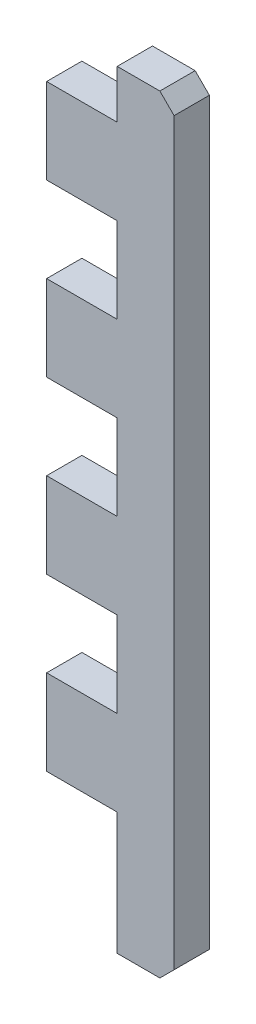
ISO-10303-21;
HEADER;
FILE_DESCRIPTION(('STEP AP214'),'2;1');
FILE_NAME('part.step','',(''),(''),'','','');
FILE_SCHEMA(('AUTOMOTIVE_DESIGN { 1 0 10303 214 1 1 1 1 }'));
ENDSEC;
DATA;
#1=APPLICATION_CONTEXT('core data for automotive mechanical design processes');
#2=APPLICATION_PROTOCOL_DEFINITION('international standard','automotive_design',2000,#1);
#3=PRODUCT_CONTEXT('',#1,'mechanical');
#4=PRODUCT('Part','Part','',(#3));
#5=PRODUCT_RELATED_PRODUCT_CATEGORY('part','',(#4));
#6=PRODUCT_DEFINITION_FORMATION('','',#4);
#7=PRODUCT_DEFINITION_CONTEXT('part definition',#1,'design');
#8=PRODUCT_DEFINITION('design','',#6,#7);
#9=PRODUCT_DEFINITION_SHAPE('','',#8);
#10=(LENGTH_UNIT() NAMED_UNIT(*) SI_UNIT(.MILLI.,.METRE.));
#11=(NAMED_UNIT(*) PLANE_ANGLE_UNIT() SI_UNIT($,.RADIAN.));
#12=(NAMED_UNIT(*) SI_UNIT($,.STERADIAN.) SOLID_ANGLE_UNIT());
#13=UNCERTAINTY_MEASURE_WITH_UNIT(LENGTH_MEASURE(1.E-05),#10,'distance_accuracy_value','');
#14=(GEOMETRIC_REPRESENTATION_CONTEXT(3) GLOBAL_UNCERTAINTY_ASSIGNED_CONTEXT((#13)) GLOBAL_UNIT_ASSIGNED_CONTEXT((#10,
#11,#12)) REPRESENTATION_CONTEXT('',''));
#15=CARTESIAN_POINT('',(0.,0.,0.));
#16=DIRECTION('',(0.,0.,1.));
#17=DIRECTION('',(1.,0.,0.));
#18=AXIS2_PLACEMENT_3D('',#15,#16,#17);
#19=CARTESIAN_POINT('',(0.,73.,12.4));
#20=DIRECTION('',(1.,0.,0.));
#21=DIRECTION('',(0.,0.,-1.));
#22=AXIS2_PLACEMENT_3D('',#19,#20,#21);
#23=PLANE('',#22);
#24=DIRECTION('',(0.,-1.,0.));
#25=VECTOR('',#24,1.);
#26=CARTESIAN_POINT('',(0.,73.,0.));
#27=LINE('',#26,#25);
#28=CARTESIAN_POINT('',(0.,103.,0.));
#29=VERTEX_POINT('',#28);
#30=CARTESIAN_POINT('',(0.,73.,0.));
#31=VERTEX_POINT('',#30);
#32=EDGE_CURVE('E213',#29,#31,#27,.T.);
#33=ORIENTED_EDGE('',*,*,#32,.T.);
#34=DIRECTION('',(0.,0.,-1.));
#35=VECTOR('',#34,1.);
#36=CARTESIAN_POINT('',(0.,73.,12.4));
#37=LINE('',#36,#35);
#38=CARTESIAN_POINT('',(0.,73.,12.4));
#39=VERTEX_POINT('',#38);
#40=EDGE_CURVE('E11',#39,#31,#37,.T.);
#41=ORIENTED_EDGE('',*,*,#40,.F.);
#42=DIRECTION('',(0.,-1.,0.));
#43=VECTOR('',#42,1.);
#44=CARTESIAN_POINT('',(0.,73.,12.4));
#45=LINE('',#44,#43);
#46=CARTESIAN_POINT('',(0.,103.,12.4));
#47=VERTEX_POINT('',#46);
#48=EDGE_CURVE('E255',#47,#39,#45,.T.);
#49=ORIENTED_EDGE('',*,*,#48,.F.);
#50=DIRECTION('',(0.,0.,-1.));
#51=VECTOR('',#50,1.);
#52=CARTESIAN_POINT('',(0.,103.,12.4));
#53=LINE('',#52,#51);
#54=EDGE_CURVE('E209',#47,#29,#53,.T.);
#55=ORIENTED_EDGE('',*,*,#54,.T.);
#56=EDGE_LOOP('',(#33,#41,#49,#55));
#57=FACE_BOUND('',#56,.T.);
#58=ADVANCED_FACE('F33',(#57),#23,.F.);
#59=CARTESIAN_POINT('',(0.,73.,12.4));
#60=DIRECTION('',(0.,-1.,0.));
#61=DIRECTION('',(0.,0.,-1.));
#62=AXIS2_PLACEMENT_3D('',#59,#60,#61);
#63=PLANE('',#62);
#64=DIRECTION('',(-1.,0.,0.));
#65=VECTOR('',#64,1.);
#66=CARTESIAN_POINT('',(0.,73.,0.));
#67=LINE('',#66,#65);
#68=CARTESIAN_POINT('',(-24.8,73.,0.));
#69=VERTEX_POINT('',#68);
#70=EDGE_CURVE('E216',#31,#69,#67,.T.);
#71=ORIENTED_EDGE('',*,*,#70,.T.);
#72=DIRECTION('',(0.,0.,-1.));
#73=VECTOR('',#72,1.);
#74=CARTESIAN_POINT('',(-24.8,73.,12.4));
#75=LINE('',#74,#73);
#76=CARTESIAN_POINT('',(-24.8,73.,12.4));
#77=VERTEX_POINT('',#76);
#78=EDGE_CURVE('E41',#77,#69,#75,.T.);
#79=ORIENTED_EDGE('',*,*,#78,.F.);
#80=DIRECTION('',(-1.,0.,0.));
#81=VECTOR('',#80,1.);
#82=CARTESIAN_POINT('',(0.,73.,12.4));
#83=LINE('',#82,#81);
#84=EDGE_CURVE('E134',#39,#77,#83,.T.);
#85=ORIENTED_EDGE('',*,*,#84,.F.);
#86=ORIENTED_EDGE('',*,*,#40,.T.);
#87=EDGE_LOOP('',(#71,#79,#85,#86));
#88=FACE_BOUND('',#87,.T.);
#89=ADVANCED_FACE('F383',(#88),#63,.F.);
#90=CARTESIAN_POINT('',(-24.8,73.,12.4));
#91=DIRECTION('',(1.,0.,0.));
#92=DIRECTION('',(0.,0.,-1.));
#93=AXIS2_PLACEMENT_3D('',#90,#91,#92);
#94=PLANE('',#93);
#95=DIRECTION('',(0.,-1.,0.));
#96=VECTOR('',#95,1.);
#97=CARTESIAN_POINT('',(-24.8,73.,0.));
#98=LINE('',#97,#96);
#99=CARTESIAN_POINT('',(-24.8,43.,0.));
#100=VERTEX_POINT('',#99);
#101=EDGE_CURVE('E218',#69,#100,#98,.T.);
#102=ORIENTED_EDGE('',*,*,#101,.T.);
#103=DIRECTION('',(0.,0.,-1.));
#104=VECTOR('',#103,1.);
#105=CARTESIAN_POINT('',(-24.8,43.,12.4));
#106=LINE('',#105,#104);
#107=CARTESIAN_POINT('',(-24.8,43.,12.4));
#108=VERTEX_POINT('',#107);
#109=EDGE_CURVE('E304',#108,#100,#106,.T.);
#110=ORIENTED_EDGE('',*,*,#109,.F.);
#111=DIRECTION('',(0.,-1.,0.));
#112=VECTOR('',#111,1.);
#113=CARTESIAN_POINT('',(-24.8,73.,12.4));
#114=LINE('',#113,#112);
#115=EDGE_CURVE('E312',#77,#108,#114,.T.);
#116=ORIENTED_EDGE('',*,*,#115,.F.);
#117=ORIENTED_EDGE('',*,*,#78,.T.);
#118=EDGE_LOOP('',(#102,#110,#116,#117));
#119=FACE_BOUND('',#118,.T.);
#120=ADVANCED_FACE('F310',(#119),#94,.F.);
#121=CARTESIAN_POINT('',(0.,43.,12.4));
#122=DIRECTION('',(0.,1.,0.));
#123=DIRECTION('',(0.,0.,1.));
#124=AXIS2_PLACEMENT_3D('',#121,#122,#123);
#125=PLANE('',#124);
#126=DIRECTION('',(1.,0.,0.));
#127=VECTOR('',#126,1.);
#128=CARTESIAN_POINT('',(0.,43.,0.));
#129=LINE('',#128,#127);
#130=CARTESIAN_POINT('',(0.,43.,0.));
#131=VERTEX_POINT('',#130);
#132=EDGE_CURVE('E220',#100,#131,#129,.T.);
#133=ORIENTED_EDGE('',*,*,#132,.T.);
#134=DIRECTION('',(0.,0.,-1.));
#135=VECTOR('',#134,1.);
#136=CARTESIAN_POINT('',(0.,43.,12.4));
#137=LINE('',#136,#135);
#138=CARTESIAN_POINT('',(0.,43.,12.4));
#139=VERTEX_POINT('',#138);
#140=EDGE_CURVE('E301',#139,#131,#137,.T.);
#141=ORIENTED_EDGE('',*,*,#140,.F.);
#142=DIRECTION('',(1.,0.,0.));
#143=VECTOR('',#142,1.);
#144=CARTESIAN_POINT('',(0.,43.,12.4));
#145=LINE('',#144,#143);
#146=EDGE_CURVE('E330',#108,#139,#145,.T.);
#147=ORIENTED_EDGE('',*,*,#146,.F.);
#148=ORIENTED_EDGE('',*,*,#109,.T.);
#149=EDGE_LOOP('',(#133,#141,#147,#148));
#150=FACE_BOUND('',#149,.T.);
#151=ADVANCED_FACE('F321',(#150),#125,.F.);
#152=CARTESIAN_POINT('',(0.,0.,12.4));
#153=DIRECTION('',(1.,0.,0.));
#154=DIRECTION('',(0.,0.,-1.));
#155=AXIS2_PLACEMENT_3D('',#152,#153,#154);
#156=PLANE('',#155);
#157=DIRECTION('',(0.,-1.,0.));
#158=VECTOR('',#157,1.);
#159=CARTESIAN_POINT('',(0.,0.,0.));
#160=LINE('',#159,#158);
#161=CARTESIAN_POINT('',(0.,0.,0.));
#162=VERTEX_POINT('',#161);
#163=EDGE_CURVE('E222',#131,#162,#160,.T.);
#164=ORIENTED_EDGE('',*,*,#163,.T.);
#165=DIRECTION('',(0.,0.,-1.));
#166=VECTOR('',#165,1.);
#167=CARTESIAN_POINT('',(0.,0.,12.4));
#168=LINE('',#167,#166);
#169=CARTESIAN_POINT('',(0.,0.,12.4));
#170=VERTEX_POINT('',#169);
#171=EDGE_CURVE('E298',#170,#162,#168,.T.);
#172=ORIENTED_EDGE('',*,*,#171,.F.);
#173=DIRECTION('',(0.,-1.,0.));
#174=VECTOR('',#173,1.);
#175=CARTESIAN_POINT('',(0.,0.,12.4));
#176=LINE('',#175,#174);
#177=EDGE_CURVE('E327',#139,#170,#176,.T.);
#178=ORIENTED_EDGE('',*,*,#177,.F.);
#179=ORIENTED_EDGE('',*,*,#140,.T.);
#180=EDGE_LOOP('',(#164,#172,#178,#179));
#181=FACE_BOUND('',#180,.T.);
#182=ADVANCED_FACE('F325',(#181),#156,.F.);
#183=CARTESIAN_POINT('',(0.,0.,12.4));
#184=DIRECTION('',(0.,1.,0.));
#185=DIRECTION('',(0.,0.,1.));
#186=AXIS2_PLACEMENT_3D('',#183,#184,#185);
#187=PLANE('',#186);
#188=DIRECTION('',(1.,0.,0.));
#189=VECTOR('',#188,1.);
#190=CARTESIAN_POINT('',(0.,0.,0.));
#191=LINE('',#190,#189);
#192=CARTESIAN_POINT('',(15.,0.,0.));
#193=VERTEX_POINT('',#192);
#194=EDGE_CURVE('E224',#162,#193,#191,.T.);
#195=ORIENTED_EDGE('',*,*,#194,.T.);
#196=DIRECTION('',(0.,0.,-1.));
#197=VECTOR('',#196,1.);
#198=CARTESIAN_POINT('',(15.,0.,12.4));
#199=LINE('',#198,#197);
#200=CARTESIAN_POINT('',(15.,0.,12.4));
#201=VERTEX_POINT('',#200);
#202=EDGE_CURVE('E295',#201,#193,#199,.T.);
#203=ORIENTED_EDGE('',*,*,#202,.F.);
#204=DIRECTION('',(1.,0.,0.));
#205=VECTOR('',#204,1.);
#206=CARTESIAN_POINT('',(0.,0.,12.4));
#207=LINE('',#206,#205);
#208=EDGE_CURVE('E329',#170,#201,#207,.T.);
#209=ORIENTED_EDGE('',*,*,#208,.F.);
#210=ORIENTED_EDGE('',*,*,#171,.T.);
#211=EDGE_LOOP('',(#195,#203,#209,#210));
#212=FACE_BOUND('',#211,.T.);
#213=ADVANCED_FACE('F396',(#212),#187,.F.);
#214=CARTESIAN_POINT('',(20.,5.,12.4));
#215=DIRECTION('',(-0.707106781186547,0.707106781186548,0.));
#216=DIRECTION('',(-0.707106781186548,-0.707106781186547,0.));
#217=AXIS2_PLACEMENT_3D('',#214,#215,#216);
#218=PLANE('',#217);
#219=DIRECTION('',(0.707106781186548,0.707106781186547,0.));
#220=VECTOR('',#219,1.);
#221=CARTESIAN_POINT('',(20.,5.,0.));
#222=LINE('',#221,#220);
#223=CARTESIAN_POINT('',(20.,5.,0.));
#224=VERTEX_POINT('',#223);
#225=EDGE_CURVE('E226',#193,#224,#222,.T.);
#226=ORIENTED_EDGE('',*,*,#225,.T.);
#227=DIRECTION('',(0.,0.,-1.));
#228=VECTOR('',#227,1.);
#229=CARTESIAN_POINT('',(20.,5.,12.4));
#230=LINE('',#229,#228);
#231=CARTESIAN_POINT('',(20.,5.,12.4));
#232=VERTEX_POINT('',#231);
#233=EDGE_CURVE('E292',#232,#224,#230,.T.);
#234=ORIENTED_EDGE('',*,*,#233,.F.);
#235=DIRECTION('',(0.707106781186548,0.707106781186547,0.));
#236=VECTOR('',#235,1.);
#237=CARTESIAN_POINT('',(20.,5.,12.4));
#238=LINE('',#237,#236);
#239=EDGE_CURVE('E332',#201,#232,#238,.T.);
#240=ORIENTED_EDGE('',*,*,#239,.F.);
#241=ORIENTED_EDGE('',*,*,#202,.T.);
#242=EDGE_LOOP('',(#226,#234,#240,#241));
#243=FACE_BOUND('',#242,.T.);
#244=ADVANCED_FACE('F399',(#243),#218,.F.);
#245=CARTESIAN_POINT('',(20.,5.,12.4));
#246=DIRECTION('',(-1.,0.,0.));
#247=DIRECTION('',(0.,0.,1.));
#248=AXIS2_PLACEMENT_3D('',#245,#246,#247);
#249=PLANE('',#248);
#250=DIRECTION('',(0.,1.,0.));
#251=VECTOR('',#250,1.);
#252=CARTESIAN_POINT('',(20.,5.,0.));
#253=LINE('',#252,#251);
#254=CARTESIAN_POINT('',(20.,265.,0.));
#255=VERTEX_POINT('',#254);
#256=EDGE_CURVE('E228',#224,#255,#253,.T.);
#257=ORIENTED_EDGE('',*,*,#256,.T.);
#258=DIRECTION('',(0.,0.,-1.));
#259=VECTOR('',#258,1.);
#260=CARTESIAN_POINT('',(20.,265.,12.4));
#261=LINE('',#260,#259);
#262=CARTESIAN_POINT('',(20.,265.,12.4));
#263=VERTEX_POINT('',#262);
#264=EDGE_CURVE('E289',#263,#255,#261,.T.);
#265=ORIENTED_EDGE('',*,*,#264,.F.);
#266=DIRECTION('',(0.,1.,0.));
#267=VECTOR('',#266,1.);
#268=CARTESIAN_POINT('',(20.,5.,12.4));
#269=LINE('',#268,#267);
#270=EDGE_CURVE('E338',#232,#263,#269,.T.);
#271=ORIENTED_EDGE('',*,*,#270,.F.);
#272=ORIENTED_EDGE('',*,*,#233,.T.);
#273=EDGE_LOOP('',(#257,#265,#271,#272));
#274=FACE_BOUND('',#273,.T.);
#275=ADVANCED_FACE('F403',(#274),#249,.F.);
#276=CARTESIAN_POINT('',(20.,265.,12.4));
#277=DIRECTION('',(-0.707106781186548,-0.707106781186547,0.));
#278=DIRECTION('',(0.707106781186547,-0.707106781186548,0.));
#279=AXIS2_PLACEMENT_3D('',#276,#277,#278);
#280=PLANE('',#279);
#281=DIRECTION('',(-0.707106781186547,0.707106781186548,0.));
#282=VECTOR('',#281,1.);
#283=CARTESIAN_POINT('',(20.,265.,0.));
#284=LINE('',#283,#282);
#285=CARTESIAN_POINT('',(15.,270.,0.));
#286=VERTEX_POINT('',#285);
#287=EDGE_CURVE('E230',#255,#286,#284,.T.);
#288=ORIENTED_EDGE('',*,*,#287,.T.);
#289=DIRECTION('',(0.,0.,-1.));
#290=VECTOR('',#289,1.);
#291=CARTESIAN_POINT('',(15.,270.,12.4));
#292=LINE('',#291,#290);
#293=CARTESIAN_POINT('',(15.,270.,12.4));
#294=VERTEX_POINT('',#293);
#295=EDGE_CURVE('E286',#294,#286,#292,.T.);
#296=ORIENTED_EDGE('',*,*,#295,.F.);
#297=DIRECTION('',(-0.707106781186547,0.707106781186548,0.));
#298=VECTOR('',#297,1.);
#299=CARTESIAN_POINT('',(20.,265.,12.4));
#300=LINE('',#299,#298);
#301=EDGE_CURVE('E340',#263,#294,#300,.T.);
#302=ORIENTED_EDGE('',*,*,#301,.F.);
#303=ORIENTED_EDGE('',*,*,#264,.T.);
#304=EDGE_LOOP('',(#288,#296,#302,#303));
#305=FACE_BOUND('',#304,.T.);
#306=ADVANCED_FACE('F407',(#305),#280,.F.);
#307=CARTESIAN_POINT('',(0.,270.,12.4));
#308=DIRECTION('',(0.,-1.,0.));
#309=DIRECTION('',(0.,0.,-1.));
#310=AXIS2_PLACEMENT_3D('',#307,#308,#309);
#311=PLANE('',#310);
#312=DIRECTION('',(-1.,0.,0.));
#313=VECTOR('',#312,1.);
#314=CARTESIAN_POINT('',(0.,270.,0.));
#315=LINE('',#314,#313);
#316=CARTESIAN_POINT('',(0.,270.,0.));
#317=VERTEX_POINT('',#316);
#318=EDGE_CURVE('E232',#286,#317,#315,.T.);
#319=ORIENTED_EDGE('',*,*,#318,.T.);
#320=DIRECTION('',(0.,0.,-1.));
#321=VECTOR('',#320,1.);
#322=CARTESIAN_POINT('',(0.,270.,12.4));
#323=LINE('',#322,#321);
#324=CARTESIAN_POINT('',(0.,270.,12.4));
#325=VERTEX_POINT('',#324);
#326=EDGE_CURVE('E283',#325,#317,#323,.T.);
#327=ORIENTED_EDGE('',*,*,#326,.F.);
#328=DIRECTION('',(-1.,0.,0.));
#329=VECTOR('',#328,1.);
#330=CARTESIAN_POINT('',(0.,270.,12.4));
#331=LINE('',#330,#329);
#332=EDGE_CURVE('E342',#294,#325,#331,.T.);
#333=ORIENTED_EDGE('',*,*,#332,.F.);
#334=ORIENTED_EDGE('',*,*,#295,.T.);
#335=EDGE_LOOP('',(#319,#327,#333,#334));
#336=FACE_BOUND('',#335,.T.);
#337=ADVANCED_FACE('F411',(#336),#311,.F.);
#338=CARTESIAN_POINT('',(0.,253.,12.4));
#339=DIRECTION('',(1.,0.,0.));
#340=DIRECTION('',(0.,0.,-1.));
#341=AXIS2_PLACEMENT_3D('',#338,#339,#340);
#342=PLANE('',#341);
#343=DIRECTION('',(0.,-1.,0.));
#344=VECTOR('',#343,1.);
#345=CARTESIAN_POINT('',(0.,253.,0.));
#346=LINE('',#345,#344);
#347=CARTESIAN_POINT('',(0.,253.,0.));
#348=VERTEX_POINT('',#347);
#349=EDGE_CURVE('E234',#317,#348,#346,.T.);
#350=ORIENTED_EDGE('',*,*,#349,.T.);
#351=DIRECTION('',(0.,0.,-1.));
#352=VECTOR('',#351,1.);
#353=CARTESIAN_POINT('',(0.,253.,12.4));
#354=LINE('',#353,#352);
#355=CARTESIAN_POINT('',(0.,253.,12.4));
#356=VERTEX_POINT('',#355);
#357=EDGE_CURVE('E280',#356,#348,#354,.T.);
#358=ORIENTED_EDGE('',*,*,#357,.F.);
#359=DIRECTION('',(0.,-1.,0.));
#360=VECTOR('',#359,1.);
#361=CARTESIAN_POINT('',(0.,253.,12.4));
#362=LINE('',#361,#360);
#363=EDGE_CURVE('E344',#325,#356,#362,.T.);
#364=ORIENTED_EDGE('',*,*,#363,.F.);
#365=ORIENTED_EDGE('',*,*,#326,.T.);
#366=EDGE_LOOP('',(#350,#358,#364,#365));
#367=FACE_BOUND('',#366,.T.);
#368=ADVANCED_FACE('F415',(#367),#342,.F.);
#369=CARTESIAN_POINT('',(0.,253.,12.4));
#370=DIRECTION('',(0.,-1.,0.));
#371=DIRECTION('',(0.,0.,-1.));
#372=AXIS2_PLACEMENT_3D('',#369,#370,#371);
#373=PLANE('',#372);
#374=DIRECTION('',(-1.,0.,0.));
#375=VECTOR('',#374,1.);
#376=CARTESIAN_POINT('',(0.,253.,0.));
#377=LINE('',#376,#375);
#378=CARTESIAN_POINT('',(-24.8,253.,0.));
#379=VERTEX_POINT('',#378);
#380=EDGE_CURVE('E236',#348,#379,#377,.T.);
#381=ORIENTED_EDGE('',*,*,#380,.T.);
#382=DIRECTION('',(0.,0.,-1.));
#383=VECTOR('',#382,1.);
#384=CARTESIAN_POINT('',(-24.8,253.,12.4));
#385=LINE('',#384,#383);
#386=CARTESIAN_POINT('',(-24.8,253.,12.4));
#387=VERTEX_POINT('',#386);
#388=EDGE_CURVE('E277',#387,#379,#385,.T.);
#389=ORIENTED_EDGE('',*,*,#388,.F.);
#390=DIRECTION('',(-1.,0.,0.));
#391=VECTOR('',#390,1.);
#392=CARTESIAN_POINT('',(0.,253.,12.4));
#393=LINE('',#392,#391);
#394=EDGE_CURVE('E346',#356,#387,#393,.T.);
#395=ORIENTED_EDGE('',*,*,#394,.F.);
#396=ORIENTED_EDGE('',*,*,#357,.T.);
#397=EDGE_LOOP('',(#381,#389,#395,#396));
#398=FACE_BOUND('',#397,.T.);
#399=ADVANCED_FACE('F419',(#398),#373,.F.);
#400=CARTESIAN_POINT('',(-24.8,253.,12.4));
#401=DIRECTION('',(1.,0.,0.));
#402=DIRECTION('',(0.,0.,-1.));
#403=AXIS2_PLACEMENT_3D('',#400,#401,#402);
#404=PLANE('',#403);
#405=DIRECTION('',(0.,-1.,0.));
#406=VECTOR('',#405,1.);
#407=CARTESIAN_POINT('',(-24.8,253.,0.));
#408=LINE('',#407,#406);
#409=CARTESIAN_POINT('',(-24.8,223.,0.));
#410=VERTEX_POINT('',#409);
#411=EDGE_CURVE('E238',#379,#410,#408,.T.);
#412=ORIENTED_EDGE('',*,*,#411,.T.);
#413=DIRECTION('',(0.,0.,-1.));
#414=VECTOR('',#413,1.);
#415=CARTESIAN_POINT('',(-24.8,223.,12.4));
#416=LINE('',#415,#414);
#417=CARTESIAN_POINT('',(-24.8,223.,12.4));
#418=VERTEX_POINT('',#417);
#419=EDGE_CURVE('E274',#418,#410,#416,.T.);
#420=ORIENTED_EDGE('',*,*,#419,.F.);
#421=DIRECTION('',(0.,-1.,0.));
#422=VECTOR('',#421,1.);
#423=CARTESIAN_POINT('',(-24.8,253.,12.4));
#424=LINE('',#423,#422);
#425=EDGE_CURVE('E348',#387,#418,#424,.T.);
#426=ORIENTED_EDGE('',*,*,#425,.F.);
#427=ORIENTED_EDGE('',*,*,#388,.T.);
#428=EDGE_LOOP('',(#412,#420,#426,#427));
#429=FACE_BOUND('',#428,.T.);
#430=ADVANCED_FACE('F423',(#429),#404,.F.);
#431=CARTESIAN_POINT('',(0.,223.,12.4));
#432=DIRECTION('',(0.,1.,0.));
#433=DIRECTION('',(-1.,0.,0.));
#434=AXIS2_PLACEMENT_3D('',#431,#432,#433);
#435=PLANE('',#434);
#436=DIRECTION('',(1.,0.,0.));
#437=VECTOR('',#436,1.);
#438=CARTESIAN_POINT('',(0.,223.,0.));
#439=LINE('',#438,#437);
#440=CARTESIAN_POINT('',(0.,223.,0.));
#441=VERTEX_POINT('',#440);
#442=EDGE_CURVE('E240',#410,#441,#439,.T.);
#443=ORIENTED_EDGE('',*,*,#442,.T.);
#444=DIRECTION('',(0.,0.,-1.));
#445=VECTOR('',#444,1.);
#446=CARTESIAN_POINT('',(0.,223.,12.4));
#447=LINE('',#446,#445);
#448=CARTESIAN_POINT('',(0.,223.,12.4));
#449=VERTEX_POINT('',#448);
#450=EDGE_CURVE('E271',#449,#441,#447,.T.);
#451=ORIENTED_EDGE('',*,*,#450,.F.);
#452=DIRECTION('',(1.,0.,0.));
#453=VECTOR('',#452,1.);
#454=CARTESIAN_POINT('',(0.,223.,12.4));
#455=LINE('',#454,#453);
#456=EDGE_CURVE('E350',#418,#449,#455,.T.);
#457=ORIENTED_EDGE('',*,*,#456,.F.);
#458=ORIENTED_EDGE('',*,*,#419,.T.);
#459=EDGE_LOOP('',(#443,#451,#457,#458));
#460=FACE_BOUND('',#459,.T.);
#461=ADVANCED_FACE('F427',(#460),#435,.F.);
#462=CARTESIAN_POINT('',(0.,193.,12.4));
#463=DIRECTION('',(1.,0.,0.));
#464=DIRECTION('',(0.,1.,0.));
#465=AXIS2_PLACEMENT_3D('',#462,#463,#464);
#466=PLANE('',#465);
#467=DIRECTION('',(0.,-1.,0.));
#468=VECTOR('',#467,1.);
#469=CARTESIAN_POINT('',(0.,193.,0.));
#470=LINE('',#469,#468);
#471=CARTESIAN_POINT('',(0.,193.,0.));
#472=VERTEX_POINT('',#471);
#473=EDGE_CURVE('E242',#441,#472,#470,.T.);
#474=ORIENTED_EDGE('',*,*,#473,.T.);
#475=DIRECTION('',(0.,0.,-1.));
#476=VECTOR('',#475,1.);
#477=CARTESIAN_POINT('',(0.,193.,12.4));
#478=LINE('',#477,#476);
#479=CARTESIAN_POINT('',(0.,193.,12.4));
#480=VERTEX_POINT('',#479);
#481=EDGE_CURVE('E268',#480,#472,#478,.T.);
#482=ORIENTED_EDGE('',*,*,#481,.F.);
#483=DIRECTION('',(0.,-1.,0.));
#484=VECTOR('',#483,1.);
#485=CARTESIAN_POINT('',(0.,193.,12.4));
#486=LINE('',#485,#484);
#487=EDGE_CURVE('E352',#449,#480,#486,.T.);
#488=ORIENTED_EDGE('',*,*,#487,.F.);
#489=ORIENTED_EDGE('',*,*,#450,.T.);
#490=EDGE_LOOP('',(#474,#482,#488,#489));
#491=FACE_BOUND('',#490,.T.);
#492=ADVANCED_FACE('F431',(#491),#466,.F.);
#493=CARTESIAN_POINT('',(0.,193.,12.4));
#494=DIRECTION('',(0.,-1.,0.));
#495=DIRECTION('',(0.,0.,-1.));
#496=AXIS2_PLACEMENT_3D('',#493,#494,#495);
#497=PLANE('',#496);
#498=DIRECTION('',(-1.,0.,0.));
#499=VECTOR('',#498,1.);
#500=CARTESIAN_POINT('',(0.,193.,0.));
#501=LINE('',#500,#499);
#502=CARTESIAN_POINT('',(-24.8,193.,0.));
#503=VERTEX_POINT('',#502);
#504=EDGE_CURVE('E244',#472,#503,#501,.T.);
#505=ORIENTED_EDGE('',*,*,#504,.T.);
#506=DIRECTION('',(0.,0.,-1.));
#507=VECTOR('',#506,1.);
#508=CARTESIAN_POINT('',(-24.8,193.,12.4));
#509=LINE('',#508,#507);
#510=CARTESIAN_POINT('',(-24.8,193.,12.4));
#511=VERTEX_POINT('',#510);
#512=EDGE_CURVE('E265',#511,#503,#509,.T.);
#513=ORIENTED_EDGE('',*,*,#512,.F.);
#514=DIRECTION('',(-1.,0.,0.));
#515=VECTOR('',#514,1.);
#516=CARTESIAN_POINT('',(0.,193.,12.4));
#517=LINE('',#516,#515);
#518=EDGE_CURVE('E354',#480,#511,#517,.T.);
#519=ORIENTED_EDGE('',*,*,#518,.F.);
#520=ORIENTED_EDGE('',*,*,#481,.T.);
#521=EDGE_LOOP('',(#505,#513,#519,#520));
#522=FACE_BOUND('',#521,.T.);
#523=ADVANCED_FACE('F435',(#522),#497,.F.);
#524=CARTESIAN_POINT('',(-24.8,193.,12.4));
#525=DIRECTION('',(1.,0.,0.));
#526=DIRECTION('',(0.,0.,-1.));
#527=AXIS2_PLACEMENT_3D('',#524,#525,#526);
#528=PLANE('',#527);
#529=DIRECTION('',(0.,-1.,0.));
#530=VECTOR('',#529,1.);
#531=CARTESIAN_POINT('',(-24.8,193.,0.));
#532=LINE('',#531,#530);
#533=CARTESIAN_POINT('',(-24.8,163.,0.));
#534=VERTEX_POINT('',#533);
#535=EDGE_CURVE('E246',#503,#534,#532,.T.);
#536=ORIENTED_EDGE('',*,*,#535,.T.);
#537=DIRECTION('',(0.,0.,-1.));
#538=VECTOR('',#537,1.);
#539=CARTESIAN_POINT('',(-24.8,163.,12.4));
#540=LINE('',#539,#538);
#541=CARTESIAN_POINT('',(-24.8,163.,12.4));
#542=VERTEX_POINT('',#541);
#543=EDGE_CURVE('E262',#542,#534,#540,.T.);
#544=ORIENTED_EDGE('',*,*,#543,.F.);
#545=DIRECTION('',(0.,-1.,0.));
#546=VECTOR('',#545,1.);
#547=CARTESIAN_POINT('',(-24.8,193.,12.4));
#548=LINE('',#547,#546);
#549=EDGE_CURVE('E356',#511,#542,#548,.T.);
#550=ORIENTED_EDGE('',*,*,#549,.F.);
#551=ORIENTED_EDGE('',*,*,#512,.T.);
#552=EDGE_LOOP('',(#536,#544,#550,#551));
#553=FACE_BOUND('',#552,.T.);
#554=ADVANCED_FACE('F439',(#553),#528,.F.);
#555=CARTESIAN_POINT('',(0.,163.,12.4));
#556=DIRECTION('',(0.,1.,0.));
#557=DIRECTION('',(0.,0.,1.));
#558=AXIS2_PLACEMENT_3D('',#555,#556,#557);
#559=PLANE('',#558);
#560=DIRECTION('',(1.,0.,0.));
#561=VECTOR('',#560,1.);
#562=CARTESIAN_POINT('',(0.,163.,0.));
#563=LINE('',#562,#561);
#564=CARTESIAN_POINT('',(0.,163.,0.));
#565=VERTEX_POINT('',#564);
#566=EDGE_CURVE('E248',#534,#565,#563,.T.);
#567=ORIENTED_EDGE('',*,*,#566,.T.);
#568=DIRECTION('',(0.,0.,-1.));
#569=VECTOR('',#568,1.);
#570=CARTESIAN_POINT('',(0.,163.,12.4));
#571=LINE('',#570,#569);
#572=CARTESIAN_POINT('',(0.,163.,12.4));
#573=VERTEX_POINT('',#572);
#574=EDGE_CURVE('E259',#573,#565,#571,.T.);
#575=ORIENTED_EDGE('',*,*,#574,.F.);
#576=DIRECTION('',(1.,0.,0.));
#577=VECTOR('',#576,1.);
#578=CARTESIAN_POINT('',(0.,163.,12.4));
#579=LINE('',#578,#577);
#580=EDGE_CURVE('E358',#542,#573,#579,.T.);
#581=ORIENTED_EDGE('',*,*,#580,.F.);
#582=ORIENTED_EDGE('',*,*,#543,.T.);
#583=EDGE_LOOP('',(#567,#575,#581,#582));
#584=FACE_BOUND('',#583,.T.);
#585=ADVANCED_FACE('F364',(#584),#559,.F.);
#586=CARTESIAN_POINT('',(0.,133.,12.4));
#587=DIRECTION('',(1.,0.,0.));
#588=DIRECTION('',(0.,1.,0.));
#589=AXIS2_PLACEMENT_3D('',#586,#587,#588);
#590=PLANE('',#589);
#591=DIRECTION('',(0.,-1.,0.));
#592=VECTOR('',#591,1.);
#593=CARTESIAN_POINT('',(0.,133.,0.));
#594=LINE('',#593,#592);
#595=CARTESIAN_POINT('',(0.,133.,0.));
#596=VERTEX_POINT('',#595);
#597=EDGE_CURVE('E250',#565,#596,#594,.T.);
#598=ORIENTED_EDGE('',*,*,#597,.T.);
#599=DIRECTION('',(0.,0.,-1.));
#600=VECTOR('',#599,1.);
#601=CARTESIAN_POINT('',(0.,133.,12.4));
#602=LINE('',#601,#600);
#603=CARTESIAN_POINT('',(0.,133.,12.4));
#604=VERTEX_POINT('',#603);
#605=EDGE_CURVE('E204',#604,#596,#602,.T.);
#606=ORIENTED_EDGE('',*,*,#605,.F.);
#607=DIRECTION('',(0.,-1.,0.));
#608=VECTOR('',#607,1.);
#609=CARTESIAN_POINT('',(0.,133.,12.4));
#610=LINE('',#609,#608);
#611=EDGE_CURVE('E195',#573,#604,#610,.T.);
#612=ORIENTED_EDGE('',*,*,#611,.F.);
#613=ORIENTED_EDGE('',*,*,#574,.T.);
#614=EDGE_LOOP('',(#598,#606,#612,#613));
#615=FACE_BOUND('',#614,.T.);
#616=ADVANCED_FACE('F368',(#615),#590,.F.);
#617=CARTESIAN_POINT('',(0.,133.,12.4));
#618=DIRECTION('',(0.,-1.,0.));
#619=DIRECTION('',(0.,0.,-1.));
#620=AXIS2_PLACEMENT_3D('',#617,#618,#619);
#621=PLANE('',#620);
#622=DIRECTION('',(-1.,0.,0.));
#623=VECTOR('',#622,1.);
#624=CARTESIAN_POINT('',(0.,133.,0.));
#625=LINE('',#624,#623);
#626=CARTESIAN_POINT('',(-24.8,133.,0.));
#627=VERTEX_POINT('',#626);
#628=EDGE_CURVE('E203',#596,#627,#625,.T.);
#629=ORIENTED_EDGE('',*,*,#628,.T.);
#630=DIRECTION('',(0.,0.,-1.));
#631=VECTOR('',#630,1.);
#632=CARTESIAN_POINT('',(-24.8,133.,12.4));
#633=LINE('',#632,#631);
#634=CARTESIAN_POINT('',(-24.8,133.,12.4));
#635=VERTEX_POINT('',#634);
#636=EDGE_CURVE('E200',#635,#627,#633,.T.);
#637=ORIENTED_EDGE('',*,*,#636,.F.);
#638=DIRECTION('',(-1.,0.,0.));
#639=VECTOR('',#638,1.);
#640=CARTESIAN_POINT('',(0.,133.,12.4));
#641=LINE('',#640,#639);
#642=EDGE_CURVE('E189',#604,#635,#641,.T.);
#643=ORIENTED_EDGE('',*,*,#642,.F.);
#644=ORIENTED_EDGE('',*,*,#605,.T.);
#645=EDGE_LOOP('',(#629,#637,#643,#644));
#646=FACE_BOUND('',#645,.T.);
#647=ADVANCED_FACE('F201',(#646),#621,.F.);
#648=CARTESIAN_POINT('',(-24.8,133.,12.4));
#649=DIRECTION('',(1.,0.,0.));
#650=DIRECTION('',(0.,0.,-1.));
#651=AXIS2_PLACEMENT_3D('',#648,#649,#650);
#652=PLANE('',#651);
#653=DIRECTION('',(0.,-1.,0.));
#654=VECTOR('',#653,1.);
#655=CARTESIAN_POINT('',(-24.8,133.,0.));
#656=LINE('',#655,#654);
#657=CARTESIAN_POINT('',(-24.8,103.,0.));
#658=VERTEX_POINT('',#657);
#659=EDGE_CURVE('E120',#627,#658,#656,.T.);
#660=ORIENTED_EDGE('',*,*,#659,.T.);
#661=DIRECTION('',(0.,0.,-1.));
#662=VECTOR('',#661,1.);
#663=CARTESIAN_POINT('',(-24.8,103.,12.4));
#664=LINE('',#663,#662);
#665=CARTESIAN_POINT('',(-24.8,103.,12.4));
#666=VERTEX_POINT('',#665);
#667=EDGE_CURVE('E205',#666,#658,#664,.T.);
#668=ORIENTED_EDGE('',*,*,#667,.F.);
#669=DIRECTION('',(0.,-1.,0.));
#670=VECTOR('',#669,1.);
#671=CARTESIAN_POINT('',(-24.8,133.,12.4));
#672=LINE('',#671,#670);
#673=EDGE_CURVE('E193',#635,#666,#672,.T.);
#674=ORIENTED_EDGE('',*,*,#673,.F.);
#675=ORIENTED_EDGE('',*,*,#636,.T.);
#676=EDGE_LOOP('',(#660,#668,#674,#675));
#677=FACE_BOUND('',#676,.T.);
#678=ADVANCED_FACE('F207',(#677),#652,.F.);
#679=CARTESIAN_POINT('',(0.,103.,12.4));
#680=DIRECTION('',(0.,1.,0.));
#681=DIRECTION('',(0.,0.,1.));
#682=AXIS2_PLACEMENT_3D('',#679,#680,#681);
#683=PLANE('',#682);
#684=DIRECTION('',(1.,0.,0.));
#685=VECTOR('',#684,1.);
#686=CARTESIAN_POINT('',(0.,103.,0.));
#687=LINE('',#686,#685);
#688=EDGE_CURVE('E126',#658,#29,#687,.T.);
#689=ORIENTED_EDGE('',*,*,#688,.T.);
#690=ORIENTED_EDGE('',*,*,#54,.F.);
#691=DIRECTION('',(1.,0.,0.));
#692=VECTOR('',#691,1.);
#693=CARTESIAN_POINT('',(0.,103.,12.4));
#694=LINE('',#693,#692);
#695=EDGE_CURVE('E49',#666,#47,#694,.T.);
#696=ORIENTED_EDGE('',*,*,#695,.F.);
#697=ORIENTED_EDGE('',*,*,#667,.T.);
#698=EDGE_LOOP('',(#689,#690,#696,#697));
#699=FACE_BOUND('',#698,.T.);
#700=ADVANCED_FACE('F372',(#699),#683,.F.);
#701=CARTESIAN_POINT('',(0.,0.,12.4));
#702=DIRECTION('',(0.,0.,1.));
#703=DIRECTION('',(1.,0.,0.));
#704=AXIS2_PLACEMENT_3D('',#701,#702,#703);
#705=PLANE('',#704);
#706=ORIENTED_EDGE('',*,*,#48,.T.);
#707=ORIENTED_EDGE('',*,*,#84,.T.);
#708=ORIENTED_EDGE('',*,*,#115,.T.);
#709=ORIENTED_EDGE('',*,*,#146,.T.);
#710=ORIENTED_EDGE('',*,*,#177,.T.);
#711=ORIENTED_EDGE('',*,*,#208,.T.);
#712=ORIENTED_EDGE('',*,*,#239,.T.);
#713=ORIENTED_EDGE('',*,*,#270,.T.);
#714=ORIENTED_EDGE('',*,*,#301,.T.);
#715=ORIENTED_EDGE('',*,*,#332,.T.);
#716=ORIENTED_EDGE('',*,*,#363,.T.);
#717=ORIENTED_EDGE('',*,*,#394,.T.);
#718=ORIENTED_EDGE('',*,*,#425,.T.);
#719=ORIENTED_EDGE('',*,*,#456,.T.);
#720=ORIENTED_EDGE('',*,*,#487,.T.);
#721=ORIENTED_EDGE('',*,*,#518,.T.);
#722=ORIENTED_EDGE('',*,*,#549,.T.);
#723=ORIENTED_EDGE('',*,*,#580,.T.);
#724=ORIENTED_EDGE('',*,*,#611,.T.);
#725=ORIENTED_EDGE('',*,*,#642,.T.);
#726=ORIENTED_EDGE('',*,*,#673,.T.);
#727=ORIENTED_EDGE('',*,*,#695,.T.);
#728=EDGE_LOOP('',(#706,#707,#708,#709,#710,#711,#712,#713,#714,#715,#716,#717,#718,#719,#720,
#721,#722,#723,#724,#725,#726,#727));
#729=FACE_BOUND('',#728,.T.);
#730=ADVANCED_FACE('F191',(#729),#705,.T.);
#731=CARTESIAN_POINT('',(0.,0.,0.));
#732=DIRECTION('',(0.,0.,1.));
#733=DIRECTION('',(1.,0.,0.));
#734=AXIS2_PLACEMENT_3D('',#731,#732,#733);
#735=PLANE('',#734);
#736=ORIENTED_EDGE('',*,*,#32,.F.);
#737=ORIENTED_EDGE('',*,*,#688,.F.);
#738=ORIENTED_EDGE('',*,*,#659,.F.);
#739=ORIENTED_EDGE('',*,*,#628,.F.);
#740=ORIENTED_EDGE('',*,*,#597,.F.);
#741=ORIENTED_EDGE('',*,*,#566,.F.);
#742=ORIENTED_EDGE('',*,*,#535,.F.);
#743=ORIENTED_EDGE('',*,*,#504,.F.);
#744=ORIENTED_EDGE('',*,*,#473,.F.);
#745=ORIENTED_EDGE('',*,*,#442,.F.);
#746=ORIENTED_EDGE('',*,*,#411,.F.);
#747=ORIENTED_EDGE('',*,*,#380,.F.);
#748=ORIENTED_EDGE('',*,*,#349,.F.);
#749=ORIENTED_EDGE('',*,*,#318,.F.);
#750=ORIENTED_EDGE('',*,*,#287,.F.);
#751=ORIENTED_EDGE('',*,*,#256,.F.);
#752=ORIENTED_EDGE('',*,*,#225,.F.);
#753=ORIENTED_EDGE('',*,*,#194,.F.);
#754=ORIENTED_EDGE('',*,*,#163,.F.);
#755=ORIENTED_EDGE('',*,*,#132,.F.);
#756=ORIENTED_EDGE('',*,*,#101,.F.);
#757=ORIENTED_EDGE('',*,*,#70,.F.);
#758=EDGE_LOOP('',(#736,#737,#738,#739,#740,#741,#742,#743,#744,#745,#746,#747,#748,#749,#750,
#751,#752,#753,#754,#755,#756,#757));
#759=FACE_BOUND('',#758,.T.);
#760=ADVANCED_FACE('F316',(#759),#735,.F.);
#761=CLOSED_SHELL('',(#58,#89,#120,#151,#182,#213,#244,#275,#306,#337,#368,#399,#430,#461,#492,
#523,#554,#585,#616,#647,#678,#700,#730,#760));
#762=MANIFOLD_SOLID_BREP('B2',#761);
#763=ADVANCED_BREP_SHAPE_REPRESENTATION('',(#18,#762),#14);
#764=SHAPE_DEFINITION_REPRESENTATION(#9,#763);
ENDSEC;
END-ISO-10303-21;
